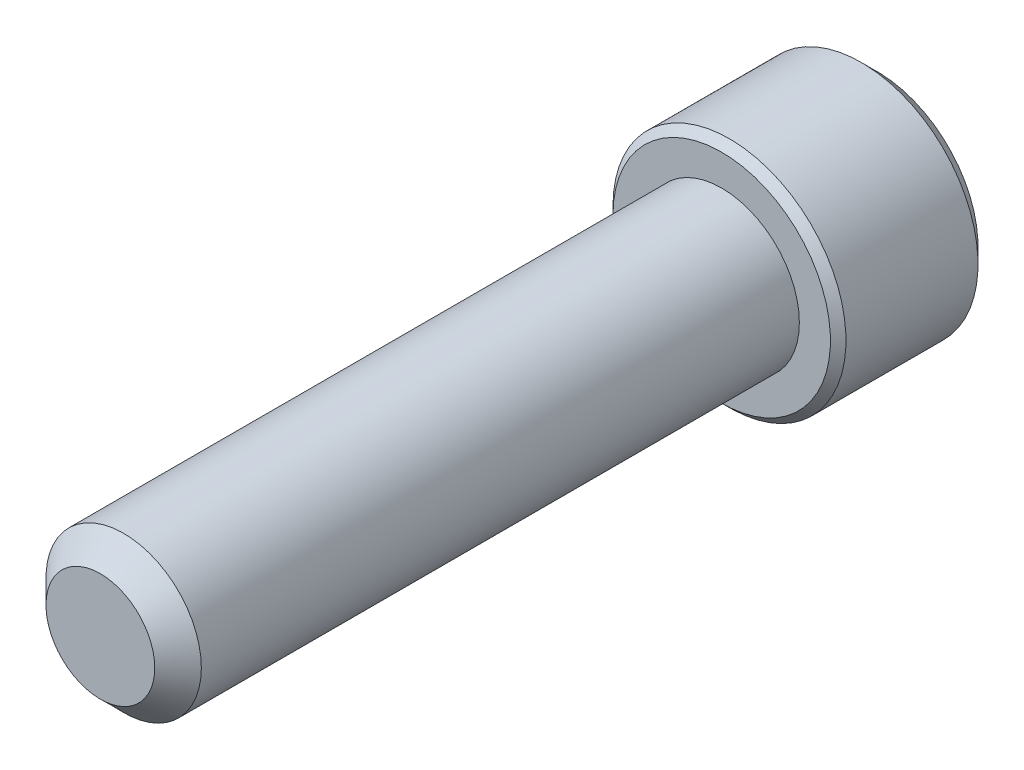
ISO-10303-21;
HEADER;
FILE_DESCRIPTION(('STEP AP214'),'2;1');
FILE_NAME('part.step','',(''),(''),'','','');
FILE_SCHEMA(('AUTOMOTIVE_DESIGN { 1 0 10303 214 1 1 1 1 }'));
ENDSEC;
DATA;
#1=APPLICATION_CONTEXT('core data for automotive mechanical design processes');
#2=APPLICATION_PROTOCOL_DEFINITION('international standard','automotive_design',2000,#1);
#3=PRODUCT_CONTEXT('',#1,'mechanical');
#4=PRODUCT('Part','Part','',(#3));
#5=PRODUCT_RELATED_PRODUCT_CATEGORY('part','',(#4));
#6=PRODUCT_DEFINITION_FORMATION('','',#4);
#7=PRODUCT_DEFINITION_CONTEXT('part definition',#1,'design');
#8=PRODUCT_DEFINITION('design','',#6,#7);
#9=PRODUCT_DEFINITION_SHAPE('','',#8);
#10=(LENGTH_UNIT() NAMED_UNIT(*) SI_UNIT(.MILLI.,.METRE.));
#11=(NAMED_UNIT(*) PLANE_ANGLE_UNIT() SI_UNIT($,.RADIAN.));
#12=(NAMED_UNIT(*) SI_UNIT($,.STERADIAN.) SOLID_ANGLE_UNIT());
#13=UNCERTAINTY_MEASURE_WITH_UNIT(LENGTH_MEASURE(1.E-05),#10,'distance_accuracy_value','');
#14=(GEOMETRIC_REPRESENTATION_CONTEXT(3) GLOBAL_UNCERTAINTY_ASSIGNED_CONTEXT((#13)) GLOBAL_UNIT_ASSIGNED_CONTEXT((#10,
#11,#12)) REPRESENTATION_CONTEXT('',''));
#15=CARTESIAN_POINT('',(0.,0.,0.));
#16=DIRECTION('',(0.,0.,1.));
#17=DIRECTION('',(1.,0.,0.));
#18=AXIS2_PLACEMENT_3D('',#15,#16,#17);
#19=CARTESIAN_POINT('',(0.,0.,-25.4));
#20=DIRECTION('',(0.,0.,1.));
#21=DIRECTION('',(1.,0.,0.));
#22=AXIS2_PLACEMENT_3D('',#19,#20,#21);
#23=CYLINDRICAL_SURFACE('',#22,3.175);
#24=CARTESIAN_POINT('',(0.,0.,-0.952499999999998));
#25=DIRECTION('',(0.,0.,1.));
#26=DIRECTION('',(1.,0.,0.));
#27=AXIS2_PLACEMENT_3D('',#24,#25,#26);
#28=CIRCLE('',#27,3.175);
#29=CARTESIAN_POINT('',(3.175,0.,-0.952499999999998));
#30=VERTEX_POINT('',#29);
#31=EDGE_CURVE('E108',#30,#30,#28,.F.);
#32=ORIENTED_EDGE('',*,*,#31,.T.);
#33=EDGE_LOOP('',(#32));
#34=FACE_BOUND('',#33,.T.);
#35=CARTESIAN_POINT('',(0.,0.,-25.4));
#36=DIRECTION('',(0.,0.,-1.));
#37=DIRECTION('',(-1.,0.,0.));
#38=AXIS2_PLACEMENT_3D('',#35,#36,#37);
#39=CIRCLE('',#38,3.175);
#40=CARTESIAN_POINT('',(-3.175,0.,-25.4));
#41=VERTEX_POINT('',#40);
#42=EDGE_CURVE('E208',#41,#41,#39,.F.);
#43=ORIENTED_EDGE('',*,*,#42,.T.);
#44=EDGE_LOOP('',(#43));
#45=FACE_BOUND('',#44,.T.);
#46=ADVANCED_FACE('F34',(#34,#45),#23,.T.);
#47=CARTESIAN_POINT('',(0.,0.,0.));
#48=DIRECTION('',(0.,0.,1.));
#49=DIRECTION('',(1.,0.,0.));
#50=AXIS2_PLACEMENT_3D('',#47,#48,#49);
#51=PLANE('',#50);
#52=CARTESIAN_POINT('',(0.,0.,0.));
#53=DIRECTION('',(0.,0.,1.));
#54=DIRECTION('',(1.,0.,0.));
#55=AXIS2_PLACEMENT_3D('',#52,#53,#54);
#56=CIRCLE('',#55,2.22250000000001);
#57=CARTESIAN_POINT('',(2.22250000000001,0.,0.));
#58=VERTEX_POINT('',#57);
#59=EDGE_CURVE('E207',#58,#58,#56,.T.);
#60=ORIENTED_EDGE('',*,*,#59,.T.);
#61=EDGE_LOOP('',(#60));
#62=FACE_BOUND('',#61,.T.);
#63=ADVANCED_FACE('F185',(#62),#51,.T.);
#64=CARTESIAN_POINT('',(0.,0.,0.));
#65=DIRECTION('',(0.,0.,-1.));
#66=DIRECTION('',(-1.,0.,0.));
#67=AXIS2_PLACEMENT_3D('',#64,#65,#66);
#68=CONICAL_SURFACE('',#67,2.22250000000001,0.785398163397446);
#69=ORIENTED_EDGE('',*,*,#31,.F.);
#70=EDGE_LOOP('',(#69));
#71=FACE_BOUND('',#70,.T.);
#72=ORIENTED_EDGE('',*,*,#59,.F.);
#73=EDGE_LOOP('',(#72));
#74=FACE_BOUND('',#73,.T.);
#75=ADVANCED_FACE('F191',(#71,#74),#68,.T.);
#76=CARTESIAN_POINT('',(0.,0.,-31.75));
#77=DIRECTION('',(0.,0.,1.));
#78=DIRECTION('',(1.,0.,0.));
#79=AXIS2_PLACEMENT_3D('',#76,#77,#78);
#80=CYLINDRICAL_SURFACE('',#79,4.7625);
#81=CARTESIAN_POINT('',(0.,0.,-25.7175));
#82=DIRECTION('',(0.,0.,-1.));
#83=DIRECTION('',(-1.,0.,0.));
#84=AXIS2_PLACEMENT_3D('',#81,#82,#83);
#85=CIRCLE('',#84,4.7625);
#86=CARTESIAN_POINT('',(-4.7625,0.,-25.7175));
#87=VERTEX_POINT('',#86);
#88=EDGE_CURVE('E42',#87,#87,#85,.T.);
#89=ORIENTED_EDGE('',*,*,#88,.T.);
#90=EDGE_LOOP('',(#89));
#91=FACE_BOUND('',#90,.T.);
#92=CARTESIAN_POINT('',(0.,0.,-31.115));
#93=DIRECTION('',(0.,0.,-1.));
#94=DIRECTION('',(-1.,0.,0.));
#95=AXIS2_PLACEMENT_3D('',#92,#93,#94);
#96=CIRCLE('',#95,4.7625);
#97=CARTESIAN_POINT('',(-4.7625,0.,-31.115));
#98=VERTEX_POINT('',#97);
#99=EDGE_CURVE('E168',#98,#98,#96,.F.);
#100=ORIENTED_EDGE('',*,*,#99,.T.);
#101=EDGE_LOOP('',(#100));
#102=FACE_BOUND('',#101,.T.);
#103=ADVANCED_FACE('F173',(#91,#102),#80,.T.);
#104=CARTESIAN_POINT('',(0.,0.,-31.75));
#105=DIRECTION('',(0.,0.,-1.));
#106=DIRECTION('',(-1.,0.,0.));
#107=AXIS2_PLACEMENT_3D('',#104,#105,#106);
#108=PLANE('',#107);
#109=CARTESIAN_POINT('',(0.,0.,-31.75));
#110=DIRECTION('',(0.,0.,-1.));
#111=DIRECTION('',(-1.,0.,0.));
#112=AXIS2_PLACEMENT_3D('',#109,#110,#111);
#113=CIRCLE('',#112,4.1275);
#114=CARTESIAN_POINT('',(-4.1275,0.,-31.75));
#115=VERTEX_POINT('',#114);
#116=EDGE_CURVE('E107',#115,#115,#113,.T.);
#117=ORIENTED_EDGE('',*,*,#116,.T.);
#118=EDGE_LOOP('',(#117));
#119=FACE_BOUND('',#118,.T.);
#120=CARTESIAN_POINT('',(0.,0.,-31.75));
#121=DIRECTION('',(0.,0.,-1.));
#122=DIRECTION('',(-1.,0.,0.));
#123=AXIS2_PLACEMENT_3D('',#120,#121,#122);
#124=CIRCLE('',#123,2.74963065701559);
#125=CARTESIAN_POINT('',(-2.38125,1.3748153285078,-31.75));
#126=VERTEX_POINT('',#125);
#127=CARTESIAN_POINT('',(0.,2.74963065701559,-31.75));
#128=VERTEX_POINT('',#127);
#129=EDGE_CURVE('E88',#126,#128,#124,.T.);
#130=ORIENTED_EDGE('',*,*,#129,.F.);
#131=CARTESIAN_POINT('',(-2.38125,-1.3748153285078,-31.75));
#132=VERTEX_POINT('',#131);
#133=EDGE_CURVE('E48',#132,#126,#124,.T.);
#134=ORIENTED_EDGE('',*,*,#133,.F.);
#135=CARTESIAN_POINT('',(0.,-2.74963065701559,-31.75));
#136=VERTEX_POINT('',#135);
#137=EDGE_CURVE('E264',#136,#132,#124,.T.);
#138=ORIENTED_EDGE('',*,*,#137,.F.);
#139=CARTESIAN_POINT('',(2.38125,-1.3748153285078,-31.75));
#140=VERTEX_POINT('',#139);
#141=EDGE_CURVE('E55',#140,#136,#124,.T.);
#142=ORIENTED_EDGE('',*,*,#141,.F.);
#143=CARTESIAN_POINT('',(2.38125,1.3748153285078,-31.75));
#144=VERTEX_POINT('',#143);
#145=EDGE_CURVE('E129',#144,#140,#124,.T.);
#146=ORIENTED_EDGE('',*,*,#145,.F.);
#147=EDGE_CURVE('E97',#128,#144,#124,.T.);
#148=ORIENTED_EDGE('',*,*,#147,.F.);
#149=EDGE_LOOP('',(#130,#134,#138,#142,#146,#148));
#150=FACE_BOUND('',#149,.T.);
#151=ADVANCED_FACE('F128',(#119,#150),#108,.T.);
#152=CARTESIAN_POINT('',(0.,0.,-25.4));
#153=DIRECTION('',(0.,0.,-1.));
#154=DIRECTION('',(-1.,0.,0.));
#155=AXIS2_PLACEMENT_3D('',#152,#153,#154);
#156=PLANE('',#155);
#157=CARTESIAN_POINT('',(0.,0.,-25.4));
#158=DIRECTION('',(0.,0.,-1.));
#159=DIRECTION('',(-1.,0.,0.));
#160=AXIS2_PLACEMENT_3D('',#157,#158,#159);
#161=CIRCLE('',#160,4.445);
#162=CARTESIAN_POINT('',(-4.445,0.,-25.4));
#163=VERTEX_POINT('',#162);
#164=EDGE_CURVE('E12',#163,#163,#161,.F.);
#165=ORIENTED_EDGE('',*,*,#164,.T.);
#166=EDGE_LOOP('',(#165));
#167=FACE_BOUND('',#166,.T.);
#168=ORIENTED_EDGE('',*,*,#42,.F.);
#169=EDGE_LOOP('',(#168));
#170=FACE_BOUND('',#169,.T.);
#171=ADVANCED_FACE('F276',(#167,#170),#156,.F.);
#172=CARTESIAN_POINT('',(0.,0.,-31.75));
#173=DIRECTION('',(0.,0.,-1.));
#174=DIRECTION('',(-1.,0.,0.));
#175=AXIS2_PLACEMENT_3D('',#172,#173,#174);
#176=CONICAL_SURFACE('',#175,2.74963065701559,0.78539816339745);
#177=ORIENTED_EDGE('',*,*,#147,.T.);
#178=CARTESIAN_POINT('',(-0.000199999999999846,2.74974612706943,-31.7501154773272));
#179=CARTESIAN_POINT('',(0.0816567823790499,2.70248609172789,-31.7028948967095));
#180=CARTESIAN_POINT('',(0.16488233377176,2.65443579722785,-31.6584475752929));
#181=CARTESIAN_POINT('',(0.33458848083804,2.556455907536,-31.5770654569856));
#182=CARTESIAN_POINT('',(0.421085217353104,2.50651699342501,-31.5401759430951));
#183=CARTESIAN_POINT('',(0.595501774009044,2.40581754748857,-31.4769834131659));
#184=CARTESIAN_POINT('',(0.683377171180676,2.35508266327638,-31.4505215587295));
#185=CARTESIAN_POINT('',(0.861062594070877,2.25249593653965,-31.4097515156161));
#186=CARTESIAN_POINT('',(0.950867191185873,2.20064722822085,-31.3954128915305));
#187=CARTESIAN_POINT('',(1.10563960313034,2.11128933452158,-31.3824757847701));
#188=CARTESIAN_POINT('',(1.17040744896962,2.07389560129144,-31.3805606046532));
#189=CARTESIAN_POINT('',(1.29983727933558,1.99916925388849,-31.3837866227677));
#190=CARTESIAN_POINT('',(1.36449921879336,1.96183666573621,-31.3889302948571));
#191=CARTESIAN_POINT('',(1.4932125485774,1.8875239901371,-31.4059813108716));
#192=CARTESIAN_POINT('',(1.55726317423486,1.85054434417201,-31.4178962213493));
#193=CARTESIAN_POINT('',(1.68425683890528,1.77722451768916,-31.447835672352));
#194=CARTESIAN_POINT('',(1.74719996243583,1.74088428837516,-31.4658597445185));
#195=CARTESIAN_POINT('',(1.90842615073218,1.64780030516185,-31.5193688075524));
#196=CARTESIAN_POINT('',(2.00570949128784,1.59163374230437,-31.5588874208722));
#197=CARTESIAN_POINT('',(2.14875606262557,1.50904576583588,-31.6256003435508));
#198=CARTESIAN_POINT('',(2.19589628894397,1.48182934348129,-31.6490402091113));
#199=CARTESIAN_POINT('',(2.28930352636664,1.42790064981105,-31.6980566766595));
#200=CARTESIAN_POINT('',(2.33557105249682,1.40118808114506,-31.7236319667669));
#201=CARTESIAN_POINT('',(2.38145,1.37469985845396,-31.7501154773272));
#202=B_SPLINE_CURVE_WITH_KNOTS('',3,(#178,#179,#180,#181,#182,#183,#184,#185,#186,#187,#188,
#189,#190,#191,#192,#193,#194,#195,#196,#197,#198,#199,#200,#201),.UNSPECIFIED.,.F.,.F.,(4,2,2,
2,2,2,2,2,2,2,2,4),(0.,0.317196610611949,0.636241461041219,0.950218950629223,1.26340583824126,
1.48752413747844,1.71172100167747,1.93616888974082,2.16059957440836,2.51709639744763,
2.69486147369099,2.87251813383154),.UNSPECIFIED.);
#203=EDGE_CURVE('E102',#128,#144,#202,.T.);
#204=ORIENTED_EDGE('',*,*,#203,.F.);
#205=EDGE_LOOP('',(#177,#204));
#206=FACE_BOUND('',#205,.T.);
#207=ADVANCED_FACE('F103',(#206),#176,.F.);
#208=ORIENTED_EDGE('',*,*,#145,.T.);
#209=CARTESIAN_POINT('',(2.38125,-2.76261914417824,-32.6476170859106));
#210=CARTESIAN_POINT('',(2.38125,-2.69544479514943,-32.5967472144995));
#211=CARTESIAN_POINT('',(2.38125,-2.62789666136504,-32.546362945401));
#212=CARTESIAN_POINT('',(2.38125,-2.49190448957586,-32.4467837706916));
#213=CARTESIAN_POINT('',(2.38125,-2.42346023302515,-32.3975891638687));
#214=CARTESIAN_POINT('',(2.38125,-2.28502676055597,-32.3002575506406));
#215=CARTESIAN_POINT('',(2.38125,-2.21502968474887,-32.2521316855727));
#216=CARTESIAN_POINT('',(2.38125,-2.07385103533268,-32.1576556100283));
#217=CARTESIAN_POINT('',(2.38125,-2.00266954553302,-32.111305274675));
#218=CARTESIAN_POINT('',(2.38125,-1.85474026830089,-32.0181368560841));
#219=CARTESIAN_POINT('',(2.38125,-1.7779099562422,-31.9714491375715));
#220=CARTESIAN_POINT('',(2.38125,-1.62247617005921,-31.8811296057942));
#221=CARTESIAN_POINT('',(2.38125,-1.5438729311814,-31.8374973902174));
#222=CARTESIAN_POINT('',(2.38125,-1.38486272128664,-31.7542071099829));
#223=CARTESIAN_POINT('',(2.38125,-1.30446163385103,-31.7145379008969));
#224=CARTESIAN_POINT('',(2.38125,-1.14145314541121,-31.6400690458985));
#225=CARTESIAN_POINT('',(2.38125,-1.05884677103565,-31.6052671795911));
#226=CARTESIAN_POINT('',(2.38125,-0.898296083282611,-31.5444298132105));
#227=CARTESIAN_POINT('',(2.38125,-0.820539229676336,-31.5179047139138));
#228=CARTESIAN_POINT('',(2.38125,-0.663135380788208,-31.47108983919));
#229=CARTESIAN_POINT('',(2.38125,-0.583488257424664,-31.4508004875941));
#230=CARTESIAN_POINT('',(2.38125,-0.424114177011518,-31.4178604073761));
#231=CARTESIAN_POINT('',(2.38125,-0.344414987413468,-31.4050775336893));
#232=CARTESIAN_POINT('',(2.38125,-0.184141832260061,-31.3874018129175));
#233=CARTESIAN_POINT('',(2.38125,-0.103568024425043,-31.3825075663093));
#234=CARTESIAN_POINT('',(2.38125,0.0546452705616243,-31.3809814589787));
#235=CARTESIAN_POINT('',(2.38125,0.132281935936972,-31.3840477838015));
#236=CARTESIAN_POINT('',(2.38125,0.286899761946939,-31.3976029014762));
#237=CARTESIAN_POINT('',(2.38125,0.363880858805094,-31.4080924083237));
#238=CARTESIAN_POINT('',(2.38125,0.517934845692857,-31.4360957917082));
#239=CARTESIAN_POINT('',(2.38125,0.594985552658722,-31.4537299282713));
#240=CARTESIAN_POINT('',(2.38125,0.747397785123015,-31.4950790150478));
#241=CARTESIAN_POINT('',(2.38125,0.822759444233745,-31.5187934824167));
#242=CARTESIAN_POINT('',(2.38125,1.05910849758949,-31.6021079749778));
#243=CARTESIAN_POINT('',(2.38125,1.2167770211933,-31.6711581303657));
#244=CARTESIAN_POINT('',(2.38125,1.44750538939386,-31.7862600463764));
#245=CARTESIAN_POINT('',(2.38125,1.52359597421916,-31.8266390557991));
#246=CARTESIAN_POINT('',(2.38125,1.67404919609775,-31.9105045048813));
#247=CARTESIAN_POINT('',(2.38125,1.74841214000065,-31.9539903870446));
#248=CARTESIAN_POINT('',(2.38125,1.89195740338856,-32.0412197494794));
#249=CARTESIAN_POINT('',(2.38125,1.96121356031988,-32.0848431033927));
#250=CARTESIAN_POINT('',(2.38125,2.09853826202221,-32.1739297074865));
#251=CARTESIAN_POINT('',(2.38125,2.16660671643358,-32.2193930967897));
#252=CARTESIAN_POINT('',(2.38125,2.30115854952532,-32.3114552847002));
#253=CARTESIAN_POINT('',(2.38125,2.36765030430945,-32.3580418921343));
#254=CARTESIAN_POINT('',(2.38125,2.49972444234839,-32.4524503252218));
#255=CARTESIAN_POINT('',(2.38125,2.56530707078417,-32.5002718074761));
#256=CARTESIAN_POINT('',(2.38125,2.63050907003793,-32.5485984125418));
#257=B_SPLINE_CURVE_WITH_KNOTS('',3,(#209,#210,#211,#212,#213,#214,#215,#216,#217,#218,#219,
#220,#221,#222,#223,#224,#225,#226,#227,#228,#229,#230,#231,#232,#233,#234,#235,#236,#237,#238,
#239,#240,#241,#242,#243,#244,#245,#246,#247,#248,#249,#250,#251,#252,#253,#254,#255,#256),
.UNSPECIFIED.,.F.,.F.,(4,2,2,2,2,2,2,2,2,2,2,2,2,2,2,2,2,2,2,2,2,2,2,4),(0.,0.252791871571637,
0.505646586835588,0.760459562131615,1.01525458283614,1.28490904188232,1.55452792903167,
1.82336591130764,2.09208085165785,2.33833488206072,2.58460564615637,2.82639989360531,
3.06815123955512,3.30087188920716,3.53361492603846,3.77045005601639,4.00726638452656,
4.52203846870486,4.78044014413053,5.03879556793987,5.28431582240013,5.52985467514944,
5.77340315432296,6.0168846207659),.UNSPECIFIED.);
#258=EDGE_CURVE('E96',#144,#140,#257,.F.);
#259=ORIENTED_EDGE('',*,*,#258,.F.);
#260=EDGE_LOOP('',(#208,#259));
#261=FACE_BOUND('',#260,.T.);
#262=ADVANCED_FACE('F270',(#261),#176,.F.);
#263=ORIENTED_EDGE('',*,*,#141,.T.);
#264=CARTESIAN_POINT('',(2.38145,-1.37469985845396,-31.7501154773272));
#265=CARTESIAN_POINT('',(2.29959321762095,-1.4219598937955,-31.7028948967095));
#266=CARTESIAN_POINT('',(2.21636766622824,-1.47001018829554,-31.6584475752929));
#267=CARTESIAN_POINT('',(2.04666151916196,-1.56799007798739,-31.5770654569856));
#268=CARTESIAN_POINT('',(1.9601647826469,-1.61792899209838,-31.5401759430951));
#269=CARTESIAN_POINT('',(1.78574822599096,-1.71862843803482,-31.4769834131659));
#270=CARTESIAN_POINT('',(1.69787282881932,-1.76936332224701,-31.4505215587295));
#271=CARTESIAN_POINT('',(1.52018740592912,-1.87195004898374,-31.4097515156161));
#272=CARTESIAN_POINT('',(1.43038280881413,-1.92379875730254,-31.3954128915305));
#273=CARTESIAN_POINT('',(1.27561039686966,-2.01315665100181,-31.3824757847701));
#274=CARTESIAN_POINT('',(1.21084255103038,-2.05055038423195,-31.3805606046532));
#275=CARTESIAN_POINT('',(1.08141272066442,-2.1252767316349,-31.3837866227677));
#276=CARTESIAN_POINT('',(1.01675078120664,-2.16260931978718,-31.3889302948571));
#277=CARTESIAN_POINT('',(0.888037451422601,-2.23692199538629,-31.4059813108716));
#278=CARTESIAN_POINT('',(0.823986825765143,-2.27390164135138,-31.4178962213493));
#279=CARTESIAN_POINT('',(0.696993161094724,-2.34722146783423,-31.447835672352));
#280=CARTESIAN_POINT('',(0.634050037564174,-2.38356169714823,-31.4658597445185));
#281=CARTESIAN_POINT('',(0.472823849267817,-2.47664568036154,-31.5193688075524));
#282=CARTESIAN_POINT('',(0.375540508712158,-2.53281224321902,-31.5588874208722));
#283=CARTESIAN_POINT('',(0.232493937374429,-2.61540021968751,-31.6256003435508));
#284=CARTESIAN_POINT('',(0.185353711056035,-2.6426166420421,-31.6490402091113));
#285=CARTESIAN_POINT('',(0.0919464736333629,-2.69654533571233,-31.6980566766595));
#286=CARTESIAN_POINT('',(0.0456789475031802,-2.72325790437833,-31.7236319667669));
#287=CARTESIAN_POINT('',(-0.000199999999998645,-2.74974612706943,-31.7501154773272));
#288=B_SPLINE_CURVE_WITH_KNOTS('',3,(#264,#265,#266,#267,#268,#269,#270,#271,#272,#273,#274,
#275,#276,#277,#278,#279,#280,#281,#282,#283,#284,#285,#286,#287),.UNSPECIFIED.,.F.,.F.,(4,2,2,
2,2,2,2,2,2,2,2,4),(0.,0.317196610611949,0.636241461041219,0.950218950629224,1.26340583824126,
1.48752413747844,1.71172100167747,1.93616888974082,2.16059957440836,2.51709639744763,
2.69486147369099,2.87251813383154),.UNSPECIFIED.);
#289=EDGE_CURVE('E138',#140,#136,#288,.T.);
#290=ORIENTED_EDGE('',*,*,#289,.F.);
#291=EDGE_LOOP('',(#263,#290));
#292=FACE_BOUND('',#291,.T.);
#293=ADVANCED_FACE('F267',(#292),#176,.F.);
#294=ORIENTED_EDGE('',*,*,#137,.T.);
#295=CARTESIAN_POINT('',(0.000199999999999723,-2.74974612706943,-31.7501154773272));
#296=CARTESIAN_POINT('',(-0.0816567823790502,-2.70248609172789,-31.7028948967095));
#297=CARTESIAN_POINT('',(-0.16488233377176,-2.65443579722785,-31.6584475752929));
#298=CARTESIAN_POINT('',(-0.334588480838041,-2.556455907536,-31.5770654569856));
#299=CARTESIAN_POINT('',(-0.421085217353104,-2.50651699342501,-31.5401759430951));
#300=CARTESIAN_POINT('',(-0.595501774009044,-2.40581754748857,-31.4769834131659));
#301=CARTESIAN_POINT('',(-0.683377171180677,-2.35508266327638,-31.4505215587295));
#302=CARTESIAN_POINT('',(-0.861062594070878,-2.25249593653965,-31.4097515156161));
#303=CARTESIAN_POINT('',(-0.950867191185873,-2.20064722822085,-31.3954128915305));
#304=CARTESIAN_POINT('',(-1.10563960313034,-2.11128933452158,-31.3824757847701));
#305=CARTESIAN_POINT('',(-1.17040744896962,-2.07389560129144,-31.3805606046532));
#306=CARTESIAN_POINT('',(-1.29983727933558,-1.99916925388849,-31.3837866227677));
#307=CARTESIAN_POINT('',(-1.36449921879336,-1.96183666573621,-31.3889302948571));
#308=CARTESIAN_POINT('',(-1.4932125485774,-1.8875239901371,-31.4059813108716));
#309=CARTESIAN_POINT('',(-1.55726317423486,-1.85054434417201,-31.4178962213493));
#310=CARTESIAN_POINT('',(-1.68425683890528,-1.77722451768916,-31.447835672352));
#311=CARTESIAN_POINT('',(-1.74719996243583,-1.74088428837516,-31.4658597445185));
#312=CARTESIAN_POINT('',(-1.90842615073218,-1.64780030516185,-31.5193688075524));
#313=CARTESIAN_POINT('',(-2.00570949128784,-1.59163374230437,-31.5588874208722));
#314=CARTESIAN_POINT('',(-2.14875606262557,-1.50904576583588,-31.6256003435508));
#315=CARTESIAN_POINT('',(-2.19589628894397,-1.48182934348129,-31.6490402091113));
#316=CARTESIAN_POINT('',(-2.28930352636664,-1.42790064981105,-31.6980566766595));
#317=CARTESIAN_POINT('',(-2.33557105249682,-1.40118808114506,-31.7236319667669));
#318=CARTESIAN_POINT('',(-2.38145,-1.37469985845396,-31.7501154773272));
#319=B_SPLINE_CURVE_WITH_KNOTS('',3,(#295,#296,#297,#298,#299,#300,#301,#302,#303,#304,#305,
#306,#307,#308,#309,#310,#311,#312,#313,#314,#315,#316,#317,#318),.UNSPECIFIED.,.F.,.F.,(4,2,2,
2,2,2,2,2,2,2,2,4),(0.,0.317196610611949,0.636241461041219,0.950218950629224,1.26340583824126,
1.48752413747844,1.71172100167747,1.93616888974082,2.16059957440836,2.51709639744763,
2.69486147369099,2.87251813383154),.UNSPECIFIED.);
#320=EDGE_CURVE('E242',#136,#132,#319,.T.);
#321=ORIENTED_EDGE('',*,*,#320,.F.);
#322=EDGE_LOOP('',(#294,#321));
#323=FACE_BOUND('',#322,.T.);
#324=ADVANCED_FACE('F266',(#323),#176,.F.);
#325=ORIENTED_EDGE('',*,*,#133,.T.);
#326=CARTESIAN_POINT('',(-2.38125,-2.76261914440418,-32.6476170860817));
#327=CARTESIAN_POINT('',(-2.38125,-2.69544479536901,-32.5967472146641));
#328=CARTESIAN_POINT('',(-2.38125,-2.62789666157823,-32.5463629455589));
#329=CARTESIAN_POINT('',(-2.38125,-2.4919044897762,-32.4467837708364));
#330=CARTESIAN_POINT('',(-2.38125,-2.42346023321903,-32.3975891640069));
#331=CARTESIAN_POINT('',(-2.38125,-2.28502676073673,-32.3002575507657));
#332=CARTESIAN_POINT('',(-2.38125,-2.21502968492295,-32.2521316856912));
#333=CARTESIAN_POINT('',(-2.38125,-2.0738510354933,-32.1576556101338));
#334=CARTESIAN_POINT('',(-2.38125,-2.00266954568685,-32.1113052747739));
#335=CARTESIAN_POINT('',(-2.38125,-1.85474026844006,-32.0181368561695));
#336=CARTESIAN_POINT('',(-2.38125,-1.77790995637349,-31.9714491376499));
#337=CARTESIAN_POINT('',(-2.38125,-1.62247617017446,-31.881129605859));
#338=CARTESIAN_POINT('',(-2.38125,-1.54387293128849,-31.8374973902755));
#339=CARTESIAN_POINT('',(-2.38125,-1.38486272137712,-31.7542071100282));
#340=CARTESIAN_POINT('',(-2.38125,-1.30446163393305,-31.7145379009361));
#341=CARTESIAN_POINT('',(-2.38125,-1.14145314547588,-31.6400690459263));
#342=CARTESIAN_POINT('',(-2.38125,-1.05884677109141,-31.6052671796135));
#343=CARTESIAN_POINT('',(-2.38125,-0.898296083334549,-31.544429813229));
#344=CARTESIAN_POINT('',(-2.38125,-0.820539229733748,-31.5179047139327));
#345=CARTESIAN_POINT('',(-2.38125,-0.663135380856748,-31.4710898392085));
#346=CARTESIAN_POINT('',(-2.38125,-0.583488257498859,-31.4508004876119));
#347=CARTESIAN_POINT('',(-2.38125,-0.424114177096841,-31.4178604073913));
#348=CARTESIAN_POINT('',(-2.38125,-0.344414987504261,-31.4050775337025));
#349=CARTESIAN_POINT('',(-2.38125,-0.184141832361617,-31.3874018129255));
#350=CARTESIAN_POINT('',(-2.38125,-0.103568024531891,-31.3825075663141));
#351=CARTESIAN_POINT('',(-2.38125,0.0546452704451426,-31.3809814589761));
#352=CARTESIAN_POINT('',(-2.38125,0.132281935816135,-31.3840477837949));
#353=CARTESIAN_POINT('',(-2.38125,0.286899761817835,-31.3976029014608));
#354=CARTESIAN_POINT('',(-2.38125,0.363880858672077,-31.4080924083037));
#355=CARTESIAN_POINT('',(-2.38125,0.517934845552119,-31.4360957916784));
#356=CARTESIAN_POINT('',(-2.38125,0.594985552514187,-31.4537299282363));
#357=CARTESIAN_POINT('',(-2.38125,0.747397784971256,-31.4950790150024));
#358=CARTESIAN_POINT('',(-2.38125,0.822759444078558,-31.5187934823661));
#359=CARTESIAN_POINT('',(-2.38125,1.05910849740065,-31.6021079749025));
#360=CARTESIAN_POINT('',(-2.38125,1.21677702097592,-31.6711581302676));
#361=CARTESIAN_POINT('',(-2.38125,1.44750538913538,-31.7862600462423));
#362=CARTESIAN_POINT('',(-2.38125,1.52359597394722,-31.8266390556526));
#363=CARTESIAN_POINT('',(-2.38125,1.67404919579932,-31.9105045047098));
#364=CARTESIAN_POINT('',(-2.38125,1.74841213968919,-31.9539903868604));
#365=CARTESIAN_POINT('',(-2.38125,1.89195740305344,-32.041219749271));
#366=CARTESIAN_POINT('',(-2.38125,1.96121355997407,-32.0848431031729));
#367=CARTESIAN_POINT('',(-2.38125,2.09853826165518,-32.1739297072439));
#368=CARTESIAN_POINT('',(-2.38125,2.16660671605602,-32.2193930965356));
#369=CARTESIAN_POINT('',(-2.38125,2.30115854912694,-32.3114552844234));
#370=CARTESIAN_POINT('',(-2.38125,2.36765030390079,-32.3580418918462));
#371=CARTESIAN_POINT('',(-2.38125,2.49972444191923,-32.4524503249111));
#372=CARTESIAN_POINT('',(-2.38125,2.5653070703448,-32.5002718071541));
#373=CARTESIAN_POINT('',(-2.38125,2.63050906958836,-32.5485984122085));
#374=B_SPLINE_CURVE_WITH_KNOTS('',3,(#326,#327,#328,#329,#330,#331,#332,#333,#334,#335,#336,
#337,#338,#339,#340,#341,#342,#343,#344,#345,#346,#347,#348,#349,#350,#351,#352,#353,#354,#355,
#356,#357,#358,#359,#360,#361,#362,#363,#364,#365,#366,#367,#368,#369,#370,#371,#372,#373),
.UNSPECIFIED.,.F.,.F.,(4,2,2,2,2,2,2,2,2,2,2,2,2,2,2,2,2,2,2,2,2,2,2,4),(0.,0.252791871598821,
0.505646586889964,0.760459562213691,1.01525458294592,1.2849090420232,1.55452792920363,
1.82336591151044,2.09208085189145,2.33833488227845,2.58460564635827,2.82639989379203,
3.06815123972667,3.30087188936523,3.53361492618304,3.77045005614642,4.00726638464204,
4.52203846871501,4.78044014408765,5.03879556784398,5.2843158222589,5.52985467496287,
5.77340315409166,6.01688462048988),.UNSPECIFIED.);
#375=EDGE_CURVE('E118',#132,#126,#374,.T.);
#376=ORIENTED_EDGE('',*,*,#375,.F.);
#377=EDGE_LOOP('',(#325,#376));
#378=FACE_BOUND('',#377,.T.);
#379=ADVANCED_FACE('F283',(#378),#176,.F.);
#380=ORIENTED_EDGE('',*,*,#129,.T.);
#381=CARTESIAN_POINT('',(-2.38145,1.37469985845396,-31.7501154773272));
#382=CARTESIAN_POINT('',(-2.29959321762095,1.4219598937955,-31.7028948967095));
#383=CARTESIAN_POINT('',(-2.21636766622824,1.47001018829554,-31.6584475752929));
#384=CARTESIAN_POINT('',(-2.04666151916196,1.56799007798739,-31.5770654569856));
#385=CARTESIAN_POINT('',(-1.9601647826469,1.61792899209838,-31.5401759430951));
#386=CARTESIAN_POINT('',(-1.78574822599096,1.71862843803482,-31.4769834131659));
#387=CARTESIAN_POINT('',(-1.69787282881932,1.76936332224701,-31.4505215587295));
#388=CARTESIAN_POINT('',(-1.52018740592912,1.87195004898374,-31.4097515156161));
#389=CARTESIAN_POINT('',(-1.43038280881413,1.92379875730254,-31.3954128915305));
#390=CARTESIAN_POINT('',(-1.27561039686966,2.01315665100181,-31.3824757847701));
#391=CARTESIAN_POINT('',(-1.21084255103038,2.05055038423195,-31.3805606046532));
#392=CARTESIAN_POINT('',(-1.08141272066442,2.1252767316349,-31.3837866227677));
#393=CARTESIAN_POINT('',(-1.01675078120664,2.16260931978718,-31.3889302948571));
#394=CARTESIAN_POINT('',(-0.8880374514226,2.23692199538629,-31.4059813108716));
#395=CARTESIAN_POINT('',(-0.823986825765143,2.27390164135138,-31.4178962213493));
#396=CARTESIAN_POINT('',(-0.696993161094724,2.34722146783423,-31.447835672352));
#397=CARTESIAN_POINT('',(-0.634050037564173,2.38356169714823,-31.4658597445185));
#398=CARTESIAN_POINT('',(-0.472823849267816,2.47664568036154,-31.5193688075524));
#399=CARTESIAN_POINT('',(-0.375540508712157,2.53281224321902,-31.5588874208722));
#400=CARTESIAN_POINT('',(-0.232493937374428,2.61540021968751,-31.6256003435508));
#401=CARTESIAN_POINT('',(-0.185353711056034,2.6426166420421,-31.6490402091113));
#402=CARTESIAN_POINT('',(-0.0919464736333624,2.69654533571233,-31.6980566766595));
#403=CARTESIAN_POINT('',(-0.0456789475031798,2.72325790437833,-31.7236319667669));
#404=CARTESIAN_POINT('',(0.00019999999999887,2.74974612706943,-31.7501154773272));
#405=B_SPLINE_CURVE_WITH_KNOTS('',3,(#381,#382,#383,#384,#385,#386,#387,#388,#389,#390,#391,
#392,#393,#394,#395,#396,#397,#398,#399,#400,#401,#402,#403,#404),.UNSPECIFIED.,.F.,.F.,(4,2,2,
2,2,2,2,2,2,2,2,4),(0.,0.317196610611949,0.63624146104122,0.950218950629224,1.26340583824126,
1.48752413747844,1.71172100167747,1.93616888974082,2.16059957440836,2.51709639744763,
2.69486147369099,2.87251813383154),.UNSPECIFIED.);
#406=EDGE_CURVE('E92',#126,#128,#405,.T.);
#407=ORIENTED_EDGE('',*,*,#406,.F.);
#408=EDGE_LOOP('',(#380,#407));
#409=FACE_BOUND('',#408,.T.);
#410=ADVANCED_FACE('F90',(#409),#176,.F.);
#411=CARTESIAN_POINT('',(2.38125,4.12444598552339,-28.178125));
#412=DIRECTION('',(0.,0.,-1.));
#413=DIRECTION('',(-1.,0.,0.));
#414=AXIS2_PLACEMENT_3D('',#411,#412,#413);
#415=PLANE('',#414);
#416=DIRECTION('',(0.866025403784439,0.5,0.));
#417=VECTOR('',#416,1.);
#418=CARTESIAN_POINT('',(-2.38125,1.3748153285078,-28.178125));
#419=LINE('',#418,#417);
#420=CARTESIAN_POINT('',(-2.38125,1.3748153285078,-28.178125));
#421=VERTEX_POINT('',#420);
#422=CARTESIAN_POINT('',(0.,2.74963065701559,-28.178125));
#423=VERTEX_POINT('',#422);
#424=EDGE_CURVE('E117',#421,#423,#419,.T.);
#425=ORIENTED_EDGE('',*,*,#424,.T.);
#426=DIRECTION('',(0.866025403784439,-0.5,0.));
#427=VECTOR('',#426,1.);
#428=CARTESIAN_POINT('',(0.,2.74963065701559,-28.178125));
#429=LINE('',#428,#427);
#430=CARTESIAN_POINT('',(2.38125,1.3748153285078,-28.178125));
#431=VERTEX_POINT('',#430);
#432=EDGE_CURVE('E122',#423,#431,#429,.T.);
#433=ORIENTED_EDGE('',*,*,#432,.T.);
#434=DIRECTION('',(0.,-1.,0.));
#435=VECTOR('',#434,1.);
#436=CARTESIAN_POINT('',(2.38125,1.3748153285078,-28.178125));
#437=LINE('',#436,#435);
#438=CARTESIAN_POINT('',(2.38125,-1.3748153285078,-28.178125));
#439=VERTEX_POINT('',#438);
#440=EDGE_CURVE('E230',#431,#439,#437,.T.);
#441=ORIENTED_EDGE('',*,*,#440,.T.);
#442=DIRECTION('',(-0.866025403784439,-0.5,0.));
#443=VECTOR('',#442,1.);
#444=CARTESIAN_POINT('',(2.38125,-1.3748153285078,-28.178125));
#445=LINE('',#444,#443);
#446=CARTESIAN_POINT('',(0.,-2.74963065701559,-28.178125));
#447=VERTEX_POINT('',#446);
#448=EDGE_CURVE('E227',#439,#447,#445,.T.);
#449=ORIENTED_EDGE('',*,*,#448,.T.);
#450=DIRECTION('',(-0.866025403784439,0.5,0.));
#451=VECTOR('',#450,1.);
#452=CARTESIAN_POINT('',(0.,-2.74963065701559,-28.178125));
#453=LINE('',#452,#451);
#454=CARTESIAN_POINT('',(-2.38125,-1.3748153285078,-28.178125));
#455=VERTEX_POINT('',#454);
#456=EDGE_CURVE('E224',#447,#455,#453,.T.);
#457=ORIENTED_EDGE('',*,*,#456,.T.);
#458=DIRECTION('',(0.,1.,0.));
#459=VECTOR('',#458,1.);
#460=CARTESIAN_POINT('',(-2.38125,-1.3748153285078,-28.178125));
#461=LINE('',#460,#459);
#462=EDGE_CURVE('E125',#455,#421,#461,.T.);
#463=ORIENTED_EDGE('',*,*,#462,.T.);
#464=EDGE_LOOP('',(#425,#433,#441,#449,#457,#463));
#465=FACE_BOUND('',#464,.T.);
#466=ADVANCED_FACE('F157',(#465),#415,.T.);
#467=CARTESIAN_POINT('',(0.,2.74963065701559,-28.178125));
#468=DIRECTION('',(0.5,0.866025403784439,0.));
#469=DIRECTION('',(-0.866025403784439,0.5,0.));
#470=AXIS2_PLACEMENT_3D('',#467,#468,#469);
#471=PLANE('',#470);
#472=DIRECTION('',(0.,0.,-1.));
#473=VECTOR('',#472,1.);
#474=CARTESIAN_POINT('',(0.,2.74963065701559,-28.178125));
#475=LINE('',#474,#473);
#476=EDGE_CURVE('E114',#423,#128,#475,.T.);
#477=ORIENTED_EDGE('',*,*,#476,.T.);
#478=ORIENTED_EDGE('',*,*,#203,.T.);
#479=DIRECTION('',(0.,0.,-1.));
#480=VECTOR('',#479,1.);
#481=CARTESIAN_POINT('',(2.38125,1.3748153285078,-28.178125));
#482=LINE('',#481,#480);
#483=EDGE_CURVE('E124',#431,#144,#482,.T.);
#484=ORIENTED_EDGE('',*,*,#483,.F.);
#485=ORIENTED_EDGE('',*,*,#432,.F.);
#486=EDGE_LOOP('',(#477,#478,#484,#485));
#487=FACE_BOUND('',#486,.T.);
#488=ADVANCED_FACE('F120',(#487),#471,.F.);
#489=CARTESIAN_POINT('',(2.38125,1.3748153285078,-28.178125));
#490=DIRECTION('',(1.,0.,0.));
#491=DIRECTION('',(0.,0.,-1.));
#492=AXIS2_PLACEMENT_3D('',#489,#490,#491);
#493=PLANE('',#492);
#494=ORIENTED_EDGE('',*,*,#483,.T.);
#495=ORIENTED_EDGE('',*,*,#258,.T.);
#496=DIRECTION('',(0.,0.,-1.));
#497=VECTOR('',#496,1.);
#498=CARTESIAN_POINT('',(2.38125,-1.3748153285078,-28.178125));
#499=LINE('',#498,#497);
#500=EDGE_CURVE('E213',#439,#140,#499,.T.);
#501=ORIENTED_EDGE('',*,*,#500,.F.);
#502=ORIENTED_EDGE('',*,*,#440,.F.);
#503=EDGE_LOOP('',(#494,#495,#501,#502));
#504=FACE_BOUND('',#503,.T.);
#505=ADVANCED_FACE('F146',(#504),#493,.F.);
#506=CARTESIAN_POINT('',(2.38125,-1.3748153285078,-28.178125));
#507=DIRECTION('',(0.5,-0.866025403784438,0.));
#508=DIRECTION('',(0.866025403784439,0.5,0.));
#509=AXIS2_PLACEMENT_3D('',#506,#507,#508);
#510=PLANE('',#509);
#511=ORIENTED_EDGE('',*,*,#500,.T.);
#512=ORIENTED_EDGE('',*,*,#289,.T.);
#513=DIRECTION('',(0.,0.,-1.));
#514=VECTOR('',#513,1.);
#515=CARTESIAN_POINT('',(0.,-2.74963065701559,-28.178125));
#516=LINE('',#515,#514);
#517=EDGE_CURVE('E216',#447,#136,#516,.T.);
#518=ORIENTED_EDGE('',*,*,#517,.F.);
#519=ORIENTED_EDGE('',*,*,#448,.F.);
#520=EDGE_LOOP('',(#511,#512,#518,#519));
#521=FACE_BOUND('',#520,.T.);
#522=ADVANCED_FACE('F150',(#521),#510,.F.);
#523=CARTESIAN_POINT('',(0.,-2.74963065701559,-28.178125));
#524=DIRECTION('',(-0.5,-0.866025403784439,0.));
#525=DIRECTION('',(0.866025403784439,-0.5,0.));
#526=AXIS2_PLACEMENT_3D('',#523,#524,#525);
#527=PLANE('',#526);
#528=ORIENTED_EDGE('',*,*,#517,.T.);
#529=ORIENTED_EDGE('',*,*,#320,.T.);
#530=DIRECTION('',(0.,0.,-1.));
#531=VECTOR('',#530,1.);
#532=CARTESIAN_POINT('',(-2.38125,-1.3748153285078,-28.178125));
#533=LINE('',#532,#531);
#534=EDGE_CURVE('E219',#455,#132,#533,.T.);
#535=ORIENTED_EDGE('',*,*,#534,.F.);
#536=ORIENTED_EDGE('',*,*,#456,.F.);
#537=EDGE_LOOP('',(#528,#529,#535,#536));
#538=FACE_BOUND('',#537,.T.);
#539=ADVANCED_FACE('F249',(#538),#527,.F.);
#540=CARTESIAN_POINT('',(-2.38125,-1.3748153285078,-28.178125));
#541=DIRECTION('',(-1.,0.,0.));
#542=DIRECTION('',(0.,-1.,0.));
#543=AXIS2_PLACEMENT_3D('',#540,#541,#542);
#544=PLANE('',#543);
#545=ORIENTED_EDGE('',*,*,#534,.T.);
#546=ORIENTED_EDGE('',*,*,#375,.T.);
#547=DIRECTION('',(0.,0.,-1.));
#548=VECTOR('',#547,1.);
#549=CARTESIAN_POINT('',(-2.38125,1.3748153285078,-28.178125));
#550=LINE('',#549,#548);
#551=EDGE_CURVE('E116',#421,#126,#550,.T.);
#552=ORIENTED_EDGE('',*,*,#551,.F.);
#553=ORIENTED_EDGE('',*,*,#462,.F.);
#554=EDGE_LOOP('',(#545,#546,#552,#553));
#555=FACE_BOUND('',#554,.T.);
#556=ADVANCED_FACE('F246',(#555),#544,.F.);
#557=CARTESIAN_POINT('',(-2.38125,1.3748153285078,-28.178125));
#558=DIRECTION('',(-0.5,0.866025403784439,0.));
#559=DIRECTION('',(-0.866025403784439,-0.5,0.));
#560=AXIS2_PLACEMENT_3D('',#557,#558,#559);
#561=PLANE('',#560);
#562=ORIENTED_EDGE('',*,*,#551,.T.);
#563=ORIENTED_EDGE('',*,*,#406,.T.);
#564=ORIENTED_EDGE('',*,*,#476,.F.);
#565=ORIENTED_EDGE('',*,*,#424,.F.);
#566=EDGE_LOOP('',(#562,#563,#564,#565));
#567=FACE_BOUND('',#566,.T.);
#568=ADVANCED_FACE('F112',(#567),#561,.F.);
#569=CARTESIAN_POINT('',(0.,0.,-31.75));
#570=DIRECTION('',(0.,0.,1.));
#571=DIRECTION('',(1.,0.,0.));
#572=AXIS2_PLACEMENT_3D('',#569,#570,#571);
#573=CONICAL_SURFACE('',#572,4.1275,0.785398163397444);
#574=ORIENTED_EDGE('',*,*,#99,.F.);
#575=EDGE_LOOP('',(#574));
#576=FACE_BOUND('',#575,.T.);
#577=ORIENTED_EDGE('',*,*,#116,.F.);
#578=EDGE_LOOP('',(#577));
#579=FACE_BOUND('',#578,.T.);
#580=ADVANCED_FACE('F177',(#576,#579),#573,.T.);
#581=CARTESIAN_POINT('',(0.,0.,-25.7175));
#582=DIRECTION('',(0.,0.,-1.));
#583=DIRECTION('',(-1.,0.,0.));
#584=AXIS2_PLACEMENT_3D('',#581,#582,#583);
#585=CONICAL_SURFACE('',#584,4.7625,0.78539816339745);
#586=ORIENTED_EDGE('',*,*,#164,.F.);
#587=EDGE_LOOP('',(#586));
#588=FACE_BOUND('',#587,.T.);
#589=ORIENTED_EDGE('',*,*,#88,.F.);
#590=EDGE_LOOP('',(#589));
#591=FACE_BOUND('',#590,.T.);
#592=ADVANCED_FACE('F36',(#588,#591),#585,.T.);
#593=CLOSED_SHELL('',(#46,#63,#75,#103,#151,#171,#207,#262,#293,#324,#379,#410,#466,#488,#505,
#522,#539,#556,#568,#580,#592));
#594=MANIFOLD_SOLID_BREP('B2',#593);
#595=ADVANCED_BREP_SHAPE_REPRESENTATION('',(#18,#594),#14);
#596=SHAPE_DEFINITION_REPRESENTATION(#9,#595);
ENDSEC;
END-ISO-10303-21;
